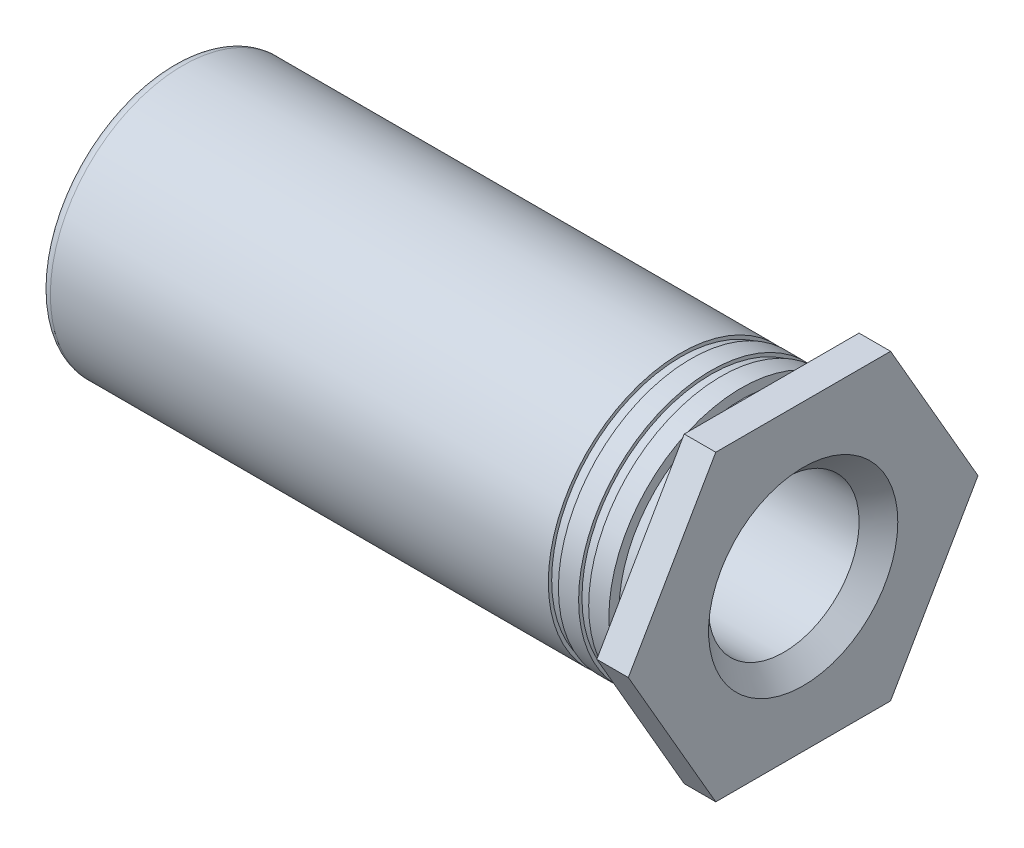
ISO-10303-21;
HEADER;
FILE_DESCRIPTION(('STEP AP214'),'2;1');
FILE_NAME('part.step','',(''),(''),'','','');
FILE_SCHEMA(('AUTOMOTIVE_DESIGN { 1 0 10303 214 1 1 1 1 }'));
ENDSEC;
DATA;
#1=APPLICATION_CONTEXT('core data for automotive mechanical design processes');
#2=APPLICATION_PROTOCOL_DEFINITION('international standard','automotive_design',2000,#1);
#3=PRODUCT_CONTEXT('',#1,'mechanical');
#4=PRODUCT('Part','Part','',(#3));
#5=PRODUCT_RELATED_PRODUCT_CATEGORY('part','',(#4));
#6=PRODUCT_DEFINITION_FORMATION('','',#4);
#7=PRODUCT_DEFINITION_CONTEXT('part definition',#1,'design');
#8=PRODUCT_DEFINITION('design','',#6,#7);
#9=PRODUCT_DEFINITION_SHAPE('','',#8);
#10=(LENGTH_UNIT() NAMED_UNIT(*) SI_UNIT(.MILLI.,.METRE.));
#11=(NAMED_UNIT(*) PLANE_ANGLE_UNIT() SI_UNIT($,.RADIAN.));
#12=(NAMED_UNIT(*) SI_UNIT($,.STERADIAN.) SOLID_ANGLE_UNIT());
#13=UNCERTAINTY_MEASURE_WITH_UNIT(LENGTH_MEASURE(1.E-05),#10,'distance_accuracy_value','');
#14=(GEOMETRIC_REPRESENTATION_CONTEXT(3) GLOBAL_UNCERTAINTY_ASSIGNED_CONTEXT((#13)) GLOBAL_UNIT_ASSIGNED_CONTEXT((#10,
#11,#12)) REPRESENTATION_CONTEXT('',''));
#15=CARTESIAN_POINT('',(0.,0.,0.));
#16=DIRECTION('',(0.,0.,1.));
#17=DIRECTION('',(1.,0.,0.));
#18=AXIS2_PLACEMENT_3D('',#15,#16,#17);
#19=CARTESIAN_POINT('',(0.,-2.4900013446,0.));
#20=DIRECTION('',(-1.,0.,0.));
#21=DIRECTION('',(0.,0.,1.));
#22=AXIS2_PLACEMENT_3D('',#19,#20,#21);
#23=PLANE('',#22);
#24=CARTESIAN_POINT('',(0.,0.,0.));
#25=DIRECTION('',(-1.,0.,0.));
#26=DIRECTION('',(0.,0.,1.));
#27=AXIS2_PLACEMENT_3D('',#24,#25,#26);
#28=CIRCLE('',#27,1.9400010476);
#29=CARTESIAN_POINT('',(0.,0.,1.9400010476));
#30=VERTEX_POINT('',#29);
#31=EDGE_CURVE('E87',#30,#30,#28,.T.);
#32=ORIENTED_EDGE('',*,*,#31,.F.);
#33=EDGE_LOOP('',(#32));
#34=FACE_BOUND('',#33,.T.);
#35=DIRECTION('',(0.,0.,1.));
#36=VECTOR('',#35,1.);
#37=CARTESIAN_POINT('',(0.,2.400001296,0.));
#38=LINE('',#37,#36);
#39=CARTESIAN_POINT('',(0.,2.400001296,-1.38564139430096));
#40=VERTEX_POINT('',#39);
#41=CARTESIAN_POINT('',(0.,2.400001296,1.38564139430096));
#42=VERTEX_POINT('',#41);
#43=EDGE_CURVE('E78',#40,#42,#38,.T.);
#44=ORIENTED_EDGE('',*,*,#43,.F.);
#45=DIRECTION('',(0.,0.866025403784429,0.500000000000017));
#46=VECTOR('',#45,1.);
#47=CARTESIAN_POINT('',(0.,1.200000648,-2.07846209145155));
#48=LINE('',#47,#46);
#49=CARTESIAN_POINT('',(0.,0.,-2.77128278860202));
#50=VERTEX_POINT('',#49);
#51=EDGE_CURVE('E423',#50,#40,#48,.T.);
#52=ORIENTED_EDGE('',*,*,#51,.F.);
#53=DIRECTION('',(0.,0.866025403784429,-0.500000000000017));
#54=VECTOR('',#53,1.);
#55=CARTESIAN_POINT('',(0.,-1.200000648,-2.07846209145155));
#56=LINE('',#55,#54);
#57=CARTESIAN_POINT('',(0.,-2.40000129600001,-1.38564139430096));
#58=VERTEX_POINT('',#57);
#59=EDGE_CURVE('E409',#58,#50,#56,.T.);
#60=ORIENTED_EDGE('',*,*,#59,.F.);
#61=DIRECTION('',(0.,0.,-1.));
#62=VECTOR('',#61,1.);
#63=CARTESIAN_POINT('',(0.,-2.400001296,0.));
#64=LINE('',#63,#62);
#65=CARTESIAN_POINT('',(0.,-2.40000129600001,1.38564139430097));
#66=VERTEX_POINT('',#65);
#67=EDGE_CURVE('E408',#66,#58,#64,.T.);
#68=ORIENTED_EDGE('',*,*,#67,.F.);
#69=DIRECTION('',(0.,-0.866025403784429,-0.500000000000017));
#70=VECTOR('',#69,1.);
#71=CARTESIAN_POINT('',(0.,-1.200000648,2.07846209145155));
#72=LINE('',#71,#70);
#73=CARTESIAN_POINT('',(0.,0.,2.77128278860202));
#74=VERTEX_POINT('',#73);
#75=EDGE_CURVE('E90',#74,#66,#72,.T.);
#76=ORIENTED_EDGE('',*,*,#75,.F.);
#77=DIRECTION('',(0.,-0.866025403784429,0.500000000000017));
#78=VECTOR('',#77,1.);
#79=CARTESIAN_POINT('',(0.,1.200000648,2.07846209145155));
#80=LINE('',#79,#78);
#81=EDGE_CURVE('E73',#42,#74,#80,.T.);
#82=ORIENTED_EDGE('',*,*,#81,.F.);
#83=EDGE_LOOP('',(#44,#52,#60,#68,#76,#82));
#84=FACE_BOUND('',#83,.T.);
#85=ADVANCED_FACE('F15',(#34,#84),#23,.T.);
#86=CARTESIAN_POINT('',(-0.2400001296,0.,0.));
#87=DIRECTION('',(-1.,0.,0.));
#88=DIRECTION('',(0.,0.,1.));
#89=AXIS2_PLACEMENT_3D('',#86,#87,#88);
#90=CYLINDRICAL_SURFACE('',#89,1.9400010476);
#91=ORIENTED_EDGE('',*,*,#31,.T.);
#92=EDGE_LOOP('',(#91));
#93=FACE_BOUND('',#92,.T.);
#94=CARTESIAN_POINT('',(-0.4800002592,0.,0.));
#95=DIRECTION('',(-1.,0.,0.));
#96=DIRECTION('',(0.,0.,1.));
#97=AXIS2_PLACEMENT_3D('',#94,#95,#96);
#98=CIRCLE('',#97,1.9400010476);
#99=CARTESIAN_POINT('',(-0.4800002592,0.,1.9400010476));
#100=VERTEX_POINT('',#99);
#101=EDGE_CURVE('E141',#100,#100,#98,.F.);
#102=ORIENTED_EDGE('',*,*,#101,.T.);
#103=EDGE_LOOP('',(#102));
#104=FACE_BOUND('',#103,.T.);
#105=ADVANCED_FACE('F261',(#93,#104),#90,.T.);
#106=CARTESIAN_POINT('',(0.250000135,2.400001296,0.));
#107=DIRECTION('',(0.,1.,0.));
#108=DIRECTION('',(0.,0.,1.));
#109=AXIS2_PLACEMENT_3D('',#106,#107,#108);
#110=PLANE('',#109);
#111=DIRECTION('',(0.,0.,-1.));
#112=VECTOR('',#111,1.);
#113=CARTESIAN_POINT('',(0.50000027,2.400001296,0.));
#114=LINE('',#113,#112);
#115=CARTESIAN_POINT('',(0.50000027,2.400001296,-1.38564139430096));
#116=VERTEX_POINT('',#115);
#117=CARTESIAN_POINT('',(0.50000027,2.400001296,1.38564139430096));
#118=VERTEX_POINT('',#117);
#119=EDGE_CURVE('E144',#116,#118,#114,.F.);
#120=ORIENTED_EDGE('',*,*,#119,.F.);
#121=DIRECTION('',(1.,0.,0.));
#122=VECTOR('',#121,1.);
#123=CARTESIAN_POINT('',(0.250000135,2.40000129600002,-1.38564139430098));
#124=LINE('',#123,#122);
#125=EDGE_CURVE('E83',#40,#116,#124,.T.);
#126=ORIENTED_EDGE('',*,*,#125,.F.);
#127=ORIENTED_EDGE('',*,*,#43,.T.);
#128=DIRECTION('',(1.,0.,0.));
#129=VECTOR('',#128,1.);
#130=CARTESIAN_POINT('',(0.250000135,2.40000129600002,1.38564139430098));
#131=LINE('',#130,#129);
#132=EDGE_CURVE('E80',#118,#42,#131,.F.);
#133=ORIENTED_EDGE('',*,*,#132,.F.);
#134=EDGE_LOOP('',(#120,#126,#127,#133));
#135=FACE_BOUND('',#134,.T.);
#136=ADVANCED_FACE('F79',(#135),#110,.T.);
#137=CARTESIAN_POINT('',(0.250000135,1.200000648,2.07846209145155));
#138=DIRECTION('',(0.,0.500000000000017,0.866025403784429));
#139=DIRECTION('',(0.,-0.866025403784429,0.500000000000017));
#140=AXIS2_PLACEMENT_3D('',#137,#138,#139);
#141=PLANE('',#140);
#142=ORIENTED_EDGE('',*,*,#81,.T.);
#143=DIRECTION('',(1.,0.,0.));
#144=VECTOR('',#143,1.);
#145=CARTESIAN_POINT('',(0.250000135,0.,2.77128278860206));
#146=LINE('',#145,#144);
#147=CARTESIAN_POINT('',(0.50000027,0.,2.77128278860202));
#148=VERTEX_POINT('',#147);
#149=EDGE_CURVE('E92',#148,#74,#146,.F.);
#150=ORIENTED_EDGE('',*,*,#149,.F.);
#151=DIRECTION('',(0.,-0.866025403784454,0.499999999999973));
#152=VECTOR('',#151,1.);
#153=CARTESIAN_POINT('',(0.50000027,2.400001296,1.38564139430095));
#154=LINE('',#153,#152);
#155=EDGE_CURVE('E96',#118,#148,#154,.T.);
#156=ORIENTED_EDGE('',*,*,#155,.F.);
#157=ORIENTED_EDGE('',*,*,#132,.T.);
#158=EDGE_LOOP('',(#142,#150,#156,#157));
#159=FACE_BOUND('',#158,.T.);
#160=ADVANCED_FACE('F94',(#159),#141,.T.);
#161=CARTESIAN_POINT('',(0.250000135,-1.200000648,2.07846209145155));
#162=DIRECTION('',(0.,-0.500000000000017,0.866025403784429));
#163=DIRECTION('',(0.,-0.866025403784429,-0.500000000000017));
#164=AXIS2_PLACEMENT_3D('',#161,#162,#163);
#165=PLANE('',#164);
#166=ORIENTED_EDGE('',*,*,#75,.T.);
#167=DIRECTION('',(1.,0.,0.));
#168=VECTOR('',#167,1.);
#169=CARTESIAN_POINT('',(0.250000135,-2.400001296,1.38564139430095));
#170=LINE('',#169,#168);
#171=CARTESIAN_POINT('',(0.50000027,-2.40000129600001,1.38564139430097));
#172=VERTEX_POINT('',#171);
#173=EDGE_CURVE('E404',#172,#66,#170,.F.);
#174=ORIENTED_EDGE('',*,*,#173,.F.);
#175=DIRECTION('',(0.,-0.866025403784454,-0.499999999999973));
#176=VECTOR('',#175,1.);
#177=CARTESIAN_POINT('',(0.50000027,0.,2.7712827886019));
#178=LINE('',#177,#176);
#179=EDGE_CURVE('E428',#148,#172,#178,.T.);
#180=ORIENTED_EDGE('',*,*,#179,.F.);
#181=ORIENTED_EDGE('',*,*,#149,.T.);
#182=EDGE_LOOP('',(#166,#174,#180,#181));
#183=FACE_BOUND('',#182,.T.);
#184=ADVANCED_FACE('F253',(#183),#165,.T.);
#185=CARTESIAN_POINT('',(0.250000135,-2.400001296,0.));
#186=DIRECTION('',(0.,-1.,0.));
#187=DIRECTION('',(0.,0.,-1.));
#188=AXIS2_PLACEMENT_3D('',#185,#186,#187);
#189=PLANE('',#188);
#190=ORIENTED_EDGE('',*,*,#67,.T.);
#191=DIRECTION('',(1.,0.,0.));
#192=VECTOR('',#191,1.);
#193=CARTESIAN_POINT('',(0.250000135,-2.40000129600002,-1.38564139430098));
#194=LINE('',#193,#192);
#195=CARTESIAN_POINT('',(0.50000027,-2.400001296,-1.38564139430096));
#196=VERTEX_POINT('',#195);
#197=EDGE_CURVE('E411',#196,#58,#194,.F.);
#198=ORIENTED_EDGE('',*,*,#197,.F.);
#199=DIRECTION('',(0.,0.,-1.));
#200=VECTOR('',#199,1.);
#201=CARTESIAN_POINT('',(0.50000027,-2.400001296,0.));
#202=LINE('',#201,#200);
#203=EDGE_CURVE('E414',#172,#196,#202,.T.);
#204=ORIENTED_EDGE('',*,*,#203,.F.);
#205=ORIENTED_EDGE('',*,*,#173,.T.);
#206=EDGE_LOOP('',(#190,#198,#204,#205));
#207=FACE_BOUND('',#206,.T.);
#208=ADVANCED_FACE('F249',(#207),#189,.T.);
#209=CARTESIAN_POINT('',(0.250000135,-1.200000648,-2.07846209145155));
#210=DIRECTION('',(0.,-0.500000000000017,-0.866025403784429));
#211=DIRECTION('',(0.,0.866025403784429,-0.500000000000017));
#212=AXIS2_PLACEMENT_3D('',#209,#210,#211);
#213=PLANE('',#212);
#214=ORIENTED_EDGE('',*,*,#59,.T.);
#215=DIRECTION('',(1.,0.,0.));
#216=VECTOR('',#215,1.);
#217=CARTESIAN_POINT('',(0.250000135,0.,-2.77128278860206));
#218=LINE('',#217,#216);
#219=CARTESIAN_POINT('',(0.50000027,0.,-2.77128278860202));
#220=VERTEX_POINT('',#219);
#221=EDGE_CURVE('E420',#220,#50,#218,.F.);
#222=ORIENTED_EDGE('',*,*,#221,.F.);
#223=DIRECTION('',(0.,0.866025403784454,-0.499999999999973));
#224=VECTOR('',#223,1.);
#225=CARTESIAN_POINT('',(0.50000027,-2.400001296,-1.38564139430095));
#226=LINE('',#225,#224);
#227=EDGE_CURVE('E431',#196,#220,#226,.T.);
#228=ORIENTED_EDGE('',*,*,#227,.F.);
#229=ORIENTED_EDGE('',*,*,#197,.T.);
#230=EDGE_LOOP('',(#214,#222,#228,#229));
#231=FACE_BOUND('',#230,.T.);
#232=ADVANCED_FACE('F245',(#231),#213,.T.);
#233=CARTESIAN_POINT('',(0.250000135,1.200000648,-2.07846209145155));
#234=DIRECTION('',(0.,0.500000000000017,-0.866025403784429));
#235=DIRECTION('',(0.,0.866025403784429,0.500000000000017));
#236=AXIS2_PLACEMENT_3D('',#233,#234,#235);
#237=PLANE('',#236);
#238=ORIENTED_EDGE('',*,*,#51,.T.);
#239=ORIENTED_EDGE('',*,*,#125,.T.);
#240=DIRECTION('',(0.,0.866025403784454,0.499999999999973));
#241=VECTOR('',#240,1.);
#242=CARTESIAN_POINT('',(0.50000027,0.,-2.7712827886019));
#243=LINE('',#242,#241);
#244=EDGE_CURVE('E140',#220,#116,#243,.T.);
#245=ORIENTED_EDGE('',*,*,#244,.F.);
#246=ORIENTED_EDGE('',*,*,#221,.T.);
#247=EDGE_LOOP('',(#238,#239,#245,#246));
#248=FACE_BOUND('',#247,.T.);
#249=ADVANCED_FACE('F241',(#248),#237,.T.);
#250=CARTESIAN_POINT('',(-0.4800002592,0.,-2.0200010908));
#251=DIRECTION('',(-1.,0.,0.));
#252=DIRECTION('',(0.,0.,1.));
#253=AXIS2_PLACEMENT_3D('',#250,#251,#252);
#254=PLANE('',#253);
#255=ORIENTED_EDGE('',*,*,#101,.F.);
#256=EDGE_LOOP('',(#255));
#257=FACE_BOUND('',#256,.T.);
#258=CARTESIAN_POINT('',(-0.4800002592,0.,0.));
#259=DIRECTION('',(-1.,0.,0.));
#260=DIRECTION('',(0.,0.,1.));
#261=AXIS2_PLACEMENT_3D('',#258,#259,#260);
#262=CIRCLE('',#261,2.100001134);
#263=CARTESIAN_POINT('',(-0.4800002592,0.,2.100001134));
#264=VERTEX_POINT('',#263);
#265=EDGE_CURVE('E137',#264,#264,#262,.T.);
#266=ORIENTED_EDGE('',*,*,#265,.F.);
#267=EDGE_LOOP('',(#266));
#268=FACE_BOUND('',#267,.T.);
#269=ADVANCED_FACE('F237',(#257,#268),#254,.F.);
#270=CARTESIAN_POINT('',(0.50000027,-1.4400007776,0.));
#271=DIRECTION('',(1.,0.,0.));
#272=DIRECTION('',(0.,0.,-1.));
#273=AXIS2_PLACEMENT_3D('',#270,#271,#272);
#274=PLANE('',#273);
#275=CARTESIAN_POINT('',(0.500000269994416,0.,0.));
#276=DIRECTION('',(1.,0.,0.));
#277=DIRECTION('',(0.,0.,-1.));
#278=AXIS2_PLACEMENT_3D('',#275,#276,#277);
#279=CIRCLE('',#278,1.50000080998325);
#280=CARTESIAN_POINT('',(0.500000269994416,0.,-1.50000080998325));
#281=VERTEX_POINT('',#280);
#282=EDGE_CURVE('E134',#281,#281,#279,.F.);
#283=ORIENTED_EDGE('',*,*,#282,.T.);
#284=EDGE_LOOP('',(#283));
#285=FACE_BOUND('',#284,.T.);
#286=ORIENTED_EDGE('',*,*,#227,.T.);
#287=ORIENTED_EDGE('',*,*,#244,.T.);
#288=ORIENTED_EDGE('',*,*,#119,.T.);
#289=ORIENTED_EDGE('',*,*,#155,.T.);
#290=ORIENTED_EDGE('',*,*,#179,.T.);
#291=ORIENTED_EDGE('',*,*,#203,.T.);
#292=EDGE_LOOP('',(#286,#287,#288,#289,#290,#291));
#293=FACE_BOUND('',#292,.T.);
#294=ADVANCED_FACE('F233',(#285,#293),#274,.T.);
#295=CARTESIAN_POINT('',(-4.66666918666582,0.,0.));
#296=DIRECTION('',(-1.,0.,0.));
#297=DIRECTION('',(0.,0.,1.));
#298=AXIS2_PLACEMENT_3D('',#295,#296,#297);
#299=CYLINDRICAL_SURFACE('',#298,2.100001134);
#300=ORIENTED_EDGE('',*,*,#265,.T.);
#301=EDGE_LOOP('',(#300));
#302=FACE_BOUND('',#301,.T.);
#303=CARTESIAN_POINT('',(-0.800000432,0.,0.));
#304=DIRECTION('',(-1.,0.,0.));
#305=DIRECTION('',(0.,0.,1.));
#306=AXIS2_PLACEMENT_3D('',#303,#304,#305);
#307=CIRCLE('',#306,2.100001134);
#308=CARTESIAN_POINT('',(-0.800000432,0.,2.100001134));
#309=VERTEX_POINT('',#308);
#310=EDGE_CURVE('E131',#309,#309,#307,.F.);
#311=ORIENTED_EDGE('',*,*,#310,.T.);
#312=EDGE_LOOP('',(#311));
#313=FACE_BOUND('',#312,.T.);
#314=ADVANCED_FACE('F229',(#302,#313),#299,.T.);
#315=CARTESIAN_POINT('',(0.500000269994416,0.,0.));
#316=DIRECTION('',(1.,0.,0.));
#317=DIRECTION('',(0.,0.,-1.));
#318=AXIS2_PLACEMENT_3D('',#315,#316,#317);
#319=CONICAL_SURFACE('',#318,1.50000080998325,0.785398163490178);
#320=ORIENTED_EDGE('',*,*,#282,.F.);
#321=EDGE_LOOP('',(#320));
#322=FACE_BOUND('',#321,.T.);
#323=CARTESIAN_POINT('',(0.19350010449,0.,0.));
#324=DIRECTION('',(1.,0.,0.));
#325=DIRECTION('',(0.,0.,-1.));
#326=AXIS2_PLACEMENT_3D('',#323,#324,#325);
#327=CIRCLE('',#326,1.19350064449);
#328=CARTESIAN_POINT('',(0.19350010449,0.,-1.19350064449));
#329=VERTEX_POINT('',#328);
#330=EDGE_CURVE('E130',#329,#329,#327,.F.);
#331=ORIENTED_EDGE('',*,*,#330,.T.);
#332=EDGE_LOOP('',(#331));
#333=FACE_BOUND('',#332,.T.);
#334=ADVANCED_FACE('F225',(#322,#333),#319,.F.);
#335=CARTESIAN_POINT('',(-0.800000432,0.,-2.07333445293342));
#336=DIRECTION('',(1.,0.,0.));
#337=DIRECTION('',(0.,0.,-1.));
#338=AXIS2_PLACEMENT_3D('',#335,#336,#337);
#339=PLANE('',#338);
#340=CARTESIAN_POINT('',(-0.800000432,0.,0.));
#341=DIRECTION('',(-1.,0.,0.));
#342=DIRECTION('',(0.,0.,1.));
#343=AXIS2_PLACEMENT_3D('',#340,#341,#342);
#344=CIRCLE('',#343,2.04666777186658);
#345=CARTESIAN_POINT('',(-0.800000432,0.,2.04666777186658));
#346=VERTEX_POINT('',#345);
#347=EDGE_CURVE('E127',#346,#346,#344,.T.);
#348=ORIENTED_EDGE('',*,*,#347,.F.);
#349=EDGE_LOOP('',(#348));
#350=FACE_BOUND('',#349,.T.);
#351=ORIENTED_EDGE('',*,*,#310,.F.);
#352=EDGE_LOOP('',(#351));
#353=FACE_BOUND('',#352,.T.);
#354=ADVANCED_FACE('F221',(#350,#353),#339,.F.);
#355=CARTESIAN_POINT('',(-2.50000135,0.,0.));
#356=DIRECTION('',(1.,0.,0.));
#357=DIRECTION('',(0.,0.,-1.));
#358=AXIS2_PLACEMENT_3D('',#355,#356,#357);
#359=CYLINDRICAL_SURFACE('',#358,1.19350064449);
#360=ORIENTED_EDGE('',*,*,#330,.F.);
#361=EDGE_LOOP('',(#360));
#362=FACE_BOUND('',#361,.T.);
#363=CARTESIAN_POINT('',(-5.19350280450226,0.,0.));
#364=DIRECTION('',(-1.,0.,0.));
#365=DIRECTION('',(0.,0.,1.));
#366=AXIS2_PLACEMENT_3D('',#363,#364,#365);
#367=CIRCLE('',#366,1.19350064449009);
#368=CARTESIAN_POINT('',(-5.19350280450226,0.,1.19350064449009));
#369=VERTEX_POINT('',#368);
#370=EDGE_CURVE('E126',#369,#369,#367,.T.);
#371=ORIENTED_EDGE('',*,*,#370,.T.);
#372=EDGE_LOOP('',(#371));
#373=FACE_BOUND('',#372,.T.);
#374=ADVANCED_FACE('F217',(#362,#373),#359,.F.);
#375=CARTESIAN_POINT('',(-0.8800004752,0.,0.));
#376=DIRECTION('',(-1.,0.,0.));
#377=DIRECTION('',(0.,0.,1.));
#378=AXIS2_PLACEMENT_3D('',#375,#376,#377);
#379=CYLINDRICAL_SURFACE('',#378,2.04666777186658);
#380=ORIENTED_EDGE('',*,*,#347,.T.);
#381=EDGE_LOOP('',(#380));
#382=FACE_BOUND('',#381,.T.);
#383=CARTESIAN_POINT('',(-0.9600005184,0.,0.));
#384=DIRECTION('',(-1.,0.,0.));
#385=DIRECTION('',(0.,0.,1.));
#386=AXIS2_PLACEMENT_3D('',#383,#384,#385);
#387=CIRCLE('',#386,2.04666777186658);
#388=CARTESIAN_POINT('',(-0.9600005184,0.,2.04666777186658));
#389=VERTEX_POINT('',#388);
#390=EDGE_CURVE('E123',#389,#389,#387,.F.);
#391=ORIENTED_EDGE('',*,*,#390,.T.);
#392=EDGE_LOOP('',(#391));
#393=FACE_BOUND('',#392,.T.);
#394=ADVANCED_FACE('F213',(#382,#393),#379,.T.);
#395=CARTESIAN_POINT('',(-5.50000296988173,0.,0.));
#396=DIRECTION('',(-1.,0.,0.));
#397=DIRECTION('',(0.,0.,1.));
#398=AXIS2_PLACEMENT_3D('',#395,#396,#397);
#399=CONICAL_SURFACE('',#398,1.50000080986956,0.785398163304718);
#400=ORIENTED_EDGE('',*,*,#370,.F.);
#401=EDGE_LOOP('',(#400));
#402=FACE_BOUND('',#401,.T.);
#403=CARTESIAN_POINT('',(-5.50000296993858,0.,0.));
#404=DIRECTION('',(-1.,0.,0.));
#405=DIRECTION('',(0.,0.,1.));
#406=AXIS2_PLACEMENT_3D('',#403,#404,#405);
#407=CIRCLE('',#406,1.50000080992641);
#408=CARTESIAN_POINT('',(-5.50000296993858,0.,1.50000080992641));
#409=VERTEX_POINT('',#408);
#410=EDGE_CURVE('E120',#409,#409,#407,.T.);
#411=ORIENTED_EDGE('',*,*,#410,.T.);
#412=EDGE_LOOP('',(#411));
#413=FACE_BOUND('',#412,.T.);
#414=ADVANCED_FACE('F209',(#402,#413),#399,.F.);
#415=CARTESIAN_POINT('',(-0.9600005184,0.,-2.07333445293342));
#416=DIRECTION('',(-1.,0.,0.));
#417=DIRECTION('',(0.,0.,1.));
#418=AXIS2_PLACEMENT_3D('',#415,#416,#417);
#419=PLANE('',#418);
#420=ORIENTED_EDGE('',*,*,#390,.F.);
#421=EDGE_LOOP('',(#420));
#422=FACE_BOUND('',#421,.T.);
#423=CARTESIAN_POINT('',(-0.9600005184,0.,0.));
#424=DIRECTION('',(-1.,0.,0.));
#425=DIRECTION('',(0.,0.,1.));
#426=AXIS2_PLACEMENT_3D('',#423,#424,#425);
#427=CIRCLE('',#426,2.100001134);
#428=CARTESIAN_POINT('',(-0.9600005184,0.,2.100001134));
#429=VERTEX_POINT('',#428);
#430=EDGE_CURVE('E117',#429,#429,#427,.T.);
#431=ORIENTED_EDGE('',*,*,#430,.F.);
#432=EDGE_LOOP('',(#431));
#433=FACE_BOUND('',#432,.T.);
#434=ADVANCED_FACE('F205',(#422,#433),#419,.F.);
#435=CARTESIAN_POINT('',(-5.50000297,0.,0.));
#436=DIRECTION('',(1.,0.,0.));
#437=DIRECTION('',(0.,0.,-1.));
#438=AXIS2_PLACEMENT_3D('',#435,#436,#437);
#439=PLANE('',#438);
#440=ORIENTED_EDGE('',*,*,#410,.F.);
#441=EDGE_LOOP('',(#440));
#442=FACE_BOUND('',#441,.T.);
#443=CARTESIAN_POINT('',(-5.50000297,0.,0.));
#444=DIRECTION('',(1.,0.,0.));
#445=DIRECTION('',(0.,0.,-1.));
#446=AXIS2_PLACEMENT_3D('',#443,#444,#445);
#447=CIRCLE('',#446,1.600000864);
#448=CARTESIAN_POINT('',(-5.50000297,0.,-1.600000864));
#449=VERTEX_POINT('',#448);
#450=EDGE_CURVE('E114',#449,#449,#447,.F.);
#451=ORIENTED_EDGE('',*,*,#450,.T.);
#452=EDGE_LOOP('',(#451));
#453=FACE_BOUND('',#452,.T.);
#454=ADVANCED_FACE('F201',(#442,#453),#439,.F.);
#455=CARTESIAN_POINT('',(-4.66666918666582,0.,0.));
#456=DIRECTION('',(-1.,0.,0.));
#457=DIRECTION('',(0.,0.,1.));
#458=AXIS2_PLACEMENT_3D('',#455,#456,#457);
#459=CYLINDRICAL_SURFACE('',#458,2.100001134);
#460=ORIENTED_EDGE('',*,*,#430,.T.);
#461=EDGE_LOOP('',(#460));
#462=FACE_BOUND('',#461,.T.);
#463=CARTESIAN_POINT('',(-1.2800006912,0.,0.));
#464=DIRECTION('',(-1.,0.,0.));
#465=DIRECTION('',(0.,0.,1.));
#466=AXIS2_PLACEMENT_3D('',#463,#464,#465);
#467=CIRCLE('',#466,2.100001134);
#468=CARTESIAN_POINT('',(-1.2800006912,0.,2.100001134));
#469=VERTEX_POINT('',#468);
#470=EDGE_CURVE('E111',#469,#469,#467,.F.);
#471=ORIENTED_EDGE('',*,*,#470,.T.);
#472=EDGE_LOOP('',(#471));
#473=FACE_BOUND('',#472,.T.);
#474=ADVANCED_FACE('F197',(#462,#473),#459,.T.);
#475=CARTESIAN_POINT('',(-7.50000405,0.,0.));
#476=DIRECTION('',(1.,0.,0.));
#477=DIRECTION('',(0.,0.,-1.));
#478=AXIS2_PLACEMENT_3D('',#475,#476,#477);
#479=CYLINDRICAL_SURFACE('',#478,1.600000864);
#480=CARTESIAN_POINT('',(-9.50000513,0.,0.));
#481=DIRECTION('',(1.,0.,0.));
#482=DIRECTION('',(0.,0.,-1.));
#483=AXIS2_PLACEMENT_3D('',#480,#481,#482);
#484=CIRCLE('',#483,1.600000864);
#485=CARTESIAN_POINT('',(-9.50000513,0.,-1.600000864));
#486=VERTEX_POINT('',#485);
#487=EDGE_CURVE('E108',#486,#486,#484,.T.);
#488=ORIENTED_EDGE('',*,*,#487,.F.);
#489=EDGE_LOOP('',(#488));
#490=FACE_BOUND('',#489,.T.);
#491=ORIENTED_EDGE('',*,*,#450,.F.);
#492=EDGE_LOOP('',(#491));
#493=FACE_BOUND('',#492,.T.);
#494=ADVANCED_FACE('F193',(#490,#493),#479,.F.);
#495=CARTESIAN_POINT('',(-1.2800006912,0.,-2.07333445293342));
#496=DIRECTION('',(1.,0.,0.));
#497=DIRECTION('',(0.,0.,-1.));
#498=AXIS2_PLACEMENT_3D('',#495,#496,#497);
#499=PLANE('',#498);
#500=CARTESIAN_POINT('',(-1.2800006912,0.,0.));
#501=DIRECTION('',(-1.,0.,0.));
#502=DIRECTION('',(0.,0.,1.));
#503=AXIS2_PLACEMENT_3D('',#500,#501,#502);
#504=CIRCLE('',#503,2.04666777186658);
#505=CARTESIAN_POINT('',(-1.2800006912,0.,2.04666777186658));
#506=VERTEX_POINT('',#505);
#507=EDGE_CURVE('E105',#506,#506,#504,.T.);
#508=ORIENTED_EDGE('',*,*,#507,.F.);
#509=EDGE_LOOP('',(#508));
#510=FACE_BOUND('',#509,.T.);
#511=ORIENTED_EDGE('',*,*,#470,.F.);
#512=EDGE_LOOP('',(#511));
#513=FACE_BOUND('',#512,.T.);
#514=ADVANCED_FACE('F188',(#510,#513),#499,.F.);
#515=CARTESIAN_POINT('',(-9.50000513,-0.966667188666582,0.));
#516=DIRECTION('',(-1.,0.,0.));
#517=DIRECTION('',(0.,0.,1.));
#518=AXIS2_PLACEMENT_3D('',#515,#516,#517);
#519=PLANE('',#518);
#520=ORIENTED_EDGE('',*,*,#487,.T.);
#521=EDGE_LOOP('',(#520));
#522=FACE_BOUND('',#521,.T.);
#523=CARTESIAN_POINT('',(-9.50000513000084,0.,0.));
#524=DIRECTION('',(1.,0.,0.));
#525=DIRECTION('',(0.,-1.,0.));
#526=AXIS2_PLACEMENT_3D('',#523,#524,#525);
#527=CIRCLE('',#526,1.93333437733342);
#528=CARTESIAN_POINT('',(-9.5000051300005,-1.93333437733342,0.));
#529=VERTEX_POINT('',#528);
#530=CARTESIAN_POINT('',(-9.5000051300005,1.93333437733342,0.));
#531=VERTEX_POINT('',#530);
#532=EDGE_CURVE('E104',#529,#531,#527,.T.);
#533=ORIENTED_EDGE('',*,*,#532,.F.);
#534=CARTESIAN_POINT('',(-9.50000513000084,0.,0.));
#535=DIRECTION('',(1.,0.,0.));
#536=DIRECTION('',(0.,1.,0.));
#537=AXIS2_PLACEMENT_3D('',#534,#535,#536);
#538=CIRCLE('',#537,1.93333437733342);
#539=EDGE_CURVE('E34',#531,#529,#538,.T.);
#540=ORIENTED_EDGE('',*,*,#539,.F.);
#541=EDGE_LOOP('',(#533,#540));
#542=FACE_BOUND('',#541,.T.);
#543=ADVANCED_FACE('F179',(#522,#542),#519,.T.);
#544=CARTESIAN_POINT('',(-1.3600007344,0.,0.));
#545=DIRECTION('',(-1.,0.,0.));
#546=DIRECTION('',(0.,0.,1.));
#547=AXIS2_PLACEMENT_3D('',#544,#545,#546);
#548=CYLINDRICAL_SURFACE('',#547,2.04666777186658);
#549=ORIENTED_EDGE('',*,*,#507,.T.);
#550=EDGE_LOOP('',(#549));
#551=FACE_BOUND('',#550,.T.);
#552=CARTESIAN_POINT('',(-1.4400007776,0.,0.));
#553=DIRECTION('',(-1.,0.,0.));
#554=DIRECTION('',(0.,0.,1.));
#555=AXIS2_PLACEMENT_3D('',#552,#553,#554);
#556=CIRCLE('',#555,2.04666777186658);
#557=CARTESIAN_POINT('',(-1.4400007776,0.,2.04666777186658));
#558=VERTEX_POINT('',#557);
#559=EDGE_CURVE('E101',#558,#558,#556,.F.);
#560=ORIENTED_EDGE('',*,*,#559,.T.);
#561=EDGE_LOOP('',(#560));
#562=FACE_BOUND('',#561,.T.);
#563=ADVANCED_FACE('F170',(#551,#562),#548,.T.);
#564=CARTESIAN_POINT('',(-9.33333837333418,0.,0.));
#565=DIRECTION('',(-1.,0.,0.));
#566=DIRECTION('',(0.,-1.,0.));
#567=AXIS2_PLACEMENT_3D('',#564,#565,#566);
#568=TOROIDAL_SURFACE('',#567,1.93333437733342,0.166666756666658);
#569=CARTESIAN_POINT('',(-9.33333837333418,0.,0.));
#570=DIRECTION('',(-1.,0.,0.));
#571=DIRECTION('',(0.,0.,1.));
#572=AXIS2_PLACEMENT_3D('',#569,#570,#571);
#573=CIRCLE('',#572,2.100001134);
#574=CARTESIAN_POINT('',(-9.33333837333418,0.,2.100001134));
#575=VERTEX_POINT('',#574);
#576=EDGE_CURVE('E26',#575,#575,#573,.F.);
#577=ORIENTED_EDGE('',*,*,#576,.F.);
#578=EDGE_LOOP('',(#577));
#579=FACE_BOUND('',#578,.T.);
#580=ORIENTED_EDGE('',*,*,#532,.T.);
#581=ORIENTED_EDGE('',*,*,#539,.T.);
#582=EDGE_LOOP('',(#580,#581));
#583=FACE_BOUND('',#582,.T.);
#584=ADVANCED_FACE('F147',(#579,#583),#568,.T.);
#585=CARTESIAN_POINT('',(-1.4400007776,0.,-2.07333445293342));
#586=DIRECTION('',(-1.,0.,0.));
#587=DIRECTION('',(0.,0.,1.));
#588=AXIS2_PLACEMENT_3D('',#585,#586,#587);
#589=PLANE('',#588);
#590=ORIENTED_EDGE('',*,*,#559,.F.);
#591=EDGE_LOOP('',(#590));
#592=FACE_BOUND('',#591,.T.);
#593=CARTESIAN_POINT('',(-1.4400007776,0.,0.));
#594=DIRECTION('',(-1.,0.,0.));
#595=DIRECTION('',(0.,0.,1.));
#596=AXIS2_PLACEMENT_3D('',#593,#594,#595);
#597=CIRCLE('',#596,2.100001134);
#598=CARTESIAN_POINT('',(-1.4400007776,0.,2.100001134));
#599=VERTEX_POINT('',#598);
#600=EDGE_CURVE('E10',#599,#599,#597,.T.);
#601=ORIENTED_EDGE('',*,*,#600,.F.);
#602=EDGE_LOOP('',(#601));
#603=FACE_BOUND('',#602,.T.);
#604=ADVANCED_FACE('F169',(#592,#603),#589,.F.);
#605=CARTESIAN_POINT('',(-4.66666918666582,0.,0.));
#606=DIRECTION('',(-1.,0.,0.));
#607=DIRECTION('',(0.,0.,1.));
#608=AXIS2_PLACEMENT_3D('',#605,#606,#607);
#609=CYLINDRICAL_SURFACE('',#608,2.100001134);
#610=ORIENTED_EDGE('',*,*,#600,.T.);
#611=EDGE_LOOP('',(#610));
#612=FACE_BOUND('',#611,.T.);
#613=ORIENTED_EDGE('',*,*,#576,.T.);
#614=EDGE_LOOP('',(#613));
#615=FACE_BOUND('',#614,.T.);
#616=ADVANCED_FACE('F270',(#612,#615),#609,.T.);
#617=CLOSED_SHELL('',(#85,#105,#136,#160,#184,#208,#232,#249,#269,#294,#314,#334,#354,#374,#394,
#414,#434,#454,#474,#494,#514,#543,#563,#584,#604,#616));
#618=MANIFOLD_SOLID_BREP('B1',#617);
#619=ADVANCED_BREP_SHAPE_REPRESENTATION('',(#18,#618),#14);
#620=SHAPE_DEFINITION_REPRESENTATION(#9,#619);
ENDSEC;
END-ISO-10303-21;
